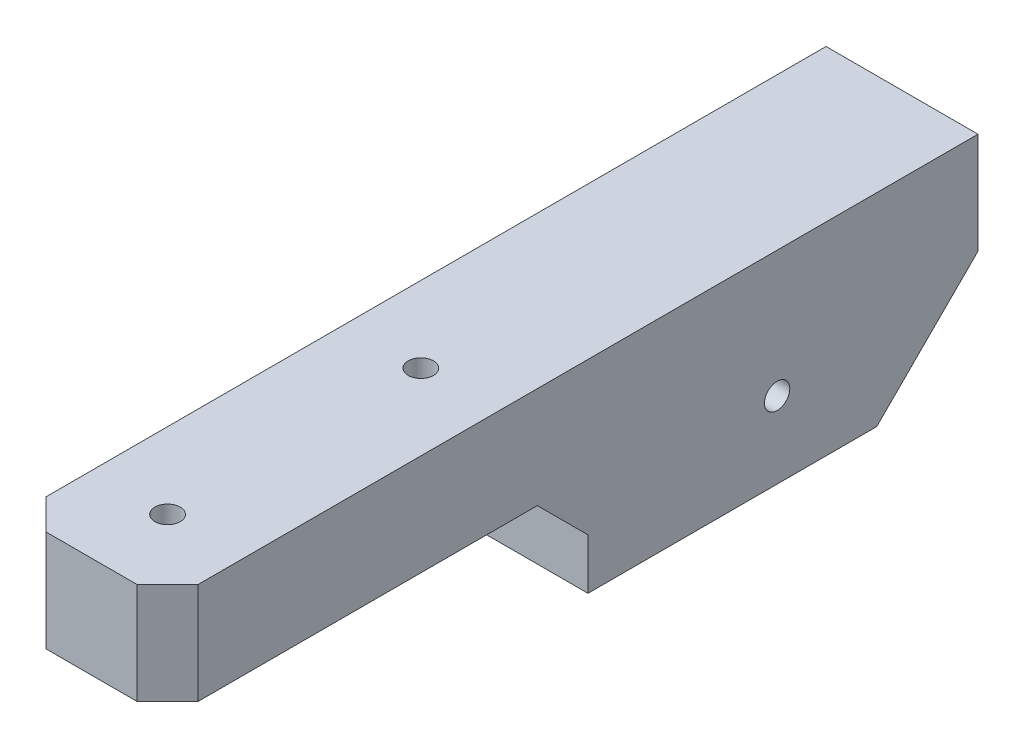
ISO-10303-21;
HEADER;
FILE_DESCRIPTION(('STEP AP214'),'2;1');
FILE_NAME('part.step','',(''),(''),'','','');
FILE_SCHEMA(('AUTOMOTIVE_DESIGN { 1 0 10303 214 1 1 1 1 }'));
ENDSEC;
DATA;
#1=APPLICATION_CONTEXT('core data for automotive mechanical design processes');
#2=APPLICATION_PROTOCOL_DEFINITION('international standard','automotive_design',2000,#1);
#3=PRODUCT_CONTEXT('',#1,'mechanical');
#4=PRODUCT('Part','Part','',(#3));
#5=PRODUCT_RELATED_PRODUCT_CATEGORY('part','',(#4));
#6=PRODUCT_DEFINITION_FORMATION('','',#4);
#7=PRODUCT_DEFINITION_CONTEXT('part definition',#1,'design');
#8=PRODUCT_DEFINITION('design','',#6,#7);
#9=PRODUCT_DEFINITION_SHAPE('','',#8);
#10=(LENGTH_UNIT() NAMED_UNIT(*) SI_UNIT(.MILLI.,.METRE.));
#11=(NAMED_UNIT(*) PLANE_ANGLE_UNIT() SI_UNIT($,.RADIAN.));
#12=(NAMED_UNIT(*) SI_UNIT($,.STERADIAN.) SOLID_ANGLE_UNIT());
#13=UNCERTAINTY_MEASURE_WITH_UNIT(LENGTH_MEASURE(1.E-05),#10,'distance_accuracy_value','');
#14=(GEOMETRIC_REPRESENTATION_CONTEXT(3) GLOBAL_UNCERTAINTY_ASSIGNED_CONTEXT((#13)) GLOBAL_UNIT_ASSIGNED_CONTEXT((#10,
#11,#12)) REPRESENTATION_CONTEXT('',''));
#15=CARTESIAN_POINT('',(0.,0.,0.));
#16=DIRECTION('',(0.,0.,1.));
#17=DIRECTION('',(1.,0.,0.));
#18=AXIS2_PLACEMENT_3D('',#15,#16,#17);
#19=CARTESIAN_POINT('',(30.,0.,80.));
#20=DIRECTION('',(0.,0.,-1.));
#21=DIRECTION('',(-1.,0.,0.));
#22=AXIS2_PLACEMENT_3D('',#19,#20,#21);
#23=PLANE('',#22);
#24=DIRECTION('',(-1.,0.,0.));
#25=VECTOR('',#24,1.);
#26=CARTESIAN_POINT('',(30.,20.,80.));
#27=LINE('',#26,#25);
#28=CARTESIAN_POINT('',(24.,20.,80.));
#29=VERTEX_POINT('',#28);
#30=CARTESIAN_POINT('',(6.00000000000001,20.,80.));
#31=VERTEX_POINT('',#30);
#32=EDGE_CURVE('E165',#29,#31,#27,.T.);
#33=ORIENTED_EDGE('',*,*,#32,.T.);
#34=DIRECTION('',(0.,-1.,0.));
#35=VECTOR('',#34,1.);
#36=CARTESIAN_POINT('',(6.00000000000001,0.,80.));
#37=LINE('',#36,#35);
#38=CARTESIAN_POINT('',(6.00000000000001,0.,80.));
#39=VERTEX_POINT('',#38);
#40=EDGE_CURVE('E197',#31,#39,#37,.T.);
#41=ORIENTED_EDGE('',*,*,#40,.T.);
#42=DIRECTION('',(-1.,0.,0.));
#43=VECTOR('',#42,1.);
#44=CARTESIAN_POINT('',(30.,0.,80.));
#45=LINE('',#44,#43);
#46=CARTESIAN_POINT('',(24.,0.,80.));
#47=VERTEX_POINT('',#46);
#48=EDGE_CURVE('E146',#47,#39,#45,.T.);
#49=ORIENTED_EDGE('',*,*,#48,.F.);
#50=DIRECTION('',(0.,1.,0.));
#51=VECTOR('',#50,1.);
#52=CARTESIAN_POINT('',(24.,0.,80.));
#53=LINE('',#52,#51);
#54=EDGE_CURVE('E195',#47,#29,#53,.T.);
#55=ORIENTED_EDGE('',*,*,#54,.T.);
#56=EDGE_LOOP('',(#33,#41,#49,#55));
#57=FACE_BOUND('',#56,.T.);
#58=ADVANCED_FACE('F41',(#57),#23,.F.);
#59=CARTESIAN_POINT('',(30.,0.,7.00000000000028));
#60=DIRECTION('',(0.,1.,0.));
#61=DIRECTION('',(0.,0.,1.));
#62=AXIS2_PLACEMENT_3D('',#59,#60,#61);
#63=PLANE('',#62);
#64=CARTESIAN_POINT('',(15.,0.,15.));
#65=DIRECTION('',(0.,1.,0.));
#66=DIRECTION('',(0.,0.,1.));
#67=AXIS2_PLACEMENT_3D('',#64,#65,#66);
#68=CIRCLE('',#67,2.5);
#69=CARTESIAN_POINT('',(15.,0.,17.5));
#70=VERTEX_POINT('',#69);
#71=EDGE_CURVE('E168',#70,#70,#68,.T.);
#72=ORIENTED_EDGE('',*,*,#71,.T.);
#73=EDGE_LOOP('',(#72));
#74=FACE_BOUND('',#73,.T.);
#75=CARTESIAN_POINT('',(15.,0.,65.));
#76=DIRECTION('',(0.,1.,0.));
#77=DIRECTION('',(0.,0.,1.));
#78=AXIS2_PLACEMENT_3D('',#75,#76,#77);
#79=CIRCLE('',#78,2.5);
#80=CARTESIAN_POINT('',(15.,0.,67.5));
#81=VERTEX_POINT('',#80);
#82=EDGE_CURVE('E404',#81,#81,#79,.T.);
#83=ORIENTED_EDGE('',*,*,#82,.T.);
#84=EDGE_LOOP('',(#83));
#85=FACE_BOUND('',#84,.T.);
#86=ORIENTED_EDGE('',*,*,#48,.T.);
#87=DIRECTION('',(-0.707106781186547,0.,-0.707106781186548));
#88=VECTOR('',#87,1.);
#89=CARTESIAN_POINT('',(6.00000000000001,0.,80.));
#90=LINE('',#89,#88);
#91=CARTESIAN_POINT('',(0.,0.,74.));
#92=VERTEX_POINT('',#91);
#93=EDGE_CURVE('E202',#39,#92,#90,.T.);
#94=ORIENTED_EDGE('',*,*,#93,.T.);
#95=DIRECTION('',(0.,0.,-1.));
#96=VECTOR('',#95,1.);
#97=CARTESIAN_POINT('',(0.,0.,7.00000000000028));
#98=LINE('',#97,#96);
#99=CARTESIAN_POINT('',(0.,0.,7.00000000000028));
#100=VERTEX_POINT('',#99);
#101=EDGE_CURVE('E143',#92,#100,#98,.T.);
#102=ORIENTED_EDGE('',*,*,#101,.T.);
#103=DIRECTION('',(-1.,0.,0.));
#104=VECTOR('',#103,1.);
#105=CARTESIAN_POINT('',(30.,0.,7.00000000000028));
#106=LINE('',#105,#104);
#107=CARTESIAN_POINT('',(30.,0.,7.00000000000028));
#108=VERTEX_POINT('',#107);
#109=EDGE_CURVE('E140',#108,#100,#106,.T.);
#110=ORIENTED_EDGE('',*,*,#109,.F.);
#111=DIRECTION('',(0.,0.,-1.));
#112=VECTOR('',#111,1.);
#113=CARTESIAN_POINT('',(30.,0.,7.00000000000028));
#114=LINE('',#113,#112);
#115=CARTESIAN_POINT('',(30.,0.,74.));
#116=VERTEX_POINT('',#115);
#117=EDGE_CURVE('E129',#116,#108,#114,.T.);
#118=ORIENTED_EDGE('',*,*,#117,.F.);
#119=DIRECTION('',(0.707106781186548,0.,-0.707106781186547));
#120=VECTOR('',#119,1.);
#121=CARTESIAN_POINT('',(30.,0.,74.));
#122=LINE('',#121,#120);
#123=EDGE_CURVE('E200',#116,#47,#122,.F.);
#124=ORIENTED_EDGE('',*,*,#123,.T.);
#125=EDGE_LOOP('',(#86,#94,#102,#110,#118,#124));
#126=FACE_BOUND('',#125,.T.);
#127=ADVANCED_FACE('F142',(#74,#85,#126),#63,.F.);
#128=CARTESIAN_POINT('',(30.,-10.,-2.99999999999977));
#129=DIRECTION('',(0.,0.707106781186549,-0.707106781186546));
#130=DIRECTION('',(0.,0.707106781186546,0.707106781186549));
#131=AXIS2_PLACEMENT_3D('',#128,#129,#130);
#132=PLANE('',#131);
#133=DIRECTION('',(0.,-0.707106781186546,-0.707106781186549));
#134=VECTOR('',#133,1.);
#135=CARTESIAN_POINT('',(0.,-10.,-2.99999999999977));
#136=LINE('',#135,#134);
#137=CARTESIAN_POINT('',(0.,-10.,-2.99999999999977));
#138=VERTEX_POINT('',#137);
#139=EDGE_CURVE('E167',#100,#138,#136,.T.);
#140=ORIENTED_EDGE('',*,*,#139,.T.);
#141=DIRECTION('',(-1.,0.,0.));
#142=VECTOR('',#141,1.);
#143=CARTESIAN_POINT('',(30.,-10.,-2.99999999999977));
#144=LINE('',#143,#142);
#145=CARTESIAN_POINT('',(30.,-10.,-2.99999999999977));
#146=VERTEX_POINT('',#145);
#147=EDGE_CURVE('E147',#146,#138,#144,.T.);
#148=ORIENTED_EDGE('',*,*,#147,.F.);
#149=DIRECTION('',(0.,-0.707106781186546,-0.707106781186549));
#150=VECTOR('',#149,1.);
#151=CARTESIAN_POINT('',(30.,-10.,-2.99999999999977));
#152=LINE('',#151,#150);
#153=EDGE_CURVE('E133',#108,#146,#152,.T.);
#154=ORIENTED_EDGE('',*,*,#153,.F.);
#155=ORIENTED_EDGE('',*,*,#109,.T.);
#156=EDGE_LOOP('',(#140,#148,#154,#155));
#157=FACE_BOUND('',#156,.T.);
#158=ADVANCED_FACE('F149',(#157),#132,.F.);
#159=CARTESIAN_POINT('',(30.,-20.,-2.99999999999977));
#160=DIRECTION('',(0.,0.,-1.));
#161=DIRECTION('',(-1.,0.,0.));
#162=AXIS2_PLACEMENT_3D('',#159,#160,#161);
#163=PLANE('',#162);
#164=DIRECTION('',(0.,-1.,0.));
#165=VECTOR('',#164,1.);
#166=CARTESIAN_POINT('',(0.,-20.,-2.99999999999977));
#167=LINE('',#166,#165);
#168=CARTESIAN_POINT('',(0.,-20.,-2.99999999999977));
#169=VERTEX_POINT('',#168);
#170=EDGE_CURVE('E170',#138,#169,#167,.T.);
#171=ORIENTED_EDGE('',*,*,#170,.T.);
#172=DIRECTION('',(-1.,0.,0.));
#173=VECTOR('',#172,1.);
#174=CARTESIAN_POINT('',(30.,-20.,-2.99999999999977));
#175=LINE('',#174,#173);
#176=CARTESIAN_POINT('',(30.,-20.,-2.99999999999977));
#177=VERTEX_POINT('',#176);
#178=EDGE_CURVE('E190',#177,#169,#175,.T.);
#179=ORIENTED_EDGE('',*,*,#178,.F.);
#180=DIRECTION('',(0.,-1.,0.));
#181=VECTOR('',#180,1.);
#182=CARTESIAN_POINT('',(30.,-20.,-2.99999999999977));
#183=LINE('',#182,#181);
#184=EDGE_CURVE('E152',#146,#177,#183,.T.);
#185=ORIENTED_EDGE('',*,*,#184,.F.);
#186=ORIENTED_EDGE('',*,*,#147,.T.);
#187=EDGE_LOOP('',(#171,#179,#185,#186));
#188=FACE_BOUND('',#187,.T.);
#189=ADVANCED_FACE('F267',(#188),#163,.F.);
#190=CARTESIAN_POINT('',(30.,-20.,-59.9999999999998));
#191=DIRECTION('',(0.,1.,0.));
#192=DIRECTION('',(0.,0.,1.));
#193=AXIS2_PLACEMENT_3D('',#190,#191,#192);
#194=PLANE('',#193);
#195=CARTESIAN_POINT('',(15.,-20.,-25.254833995939));
#196=DIRECTION('',(0.,1.,0.));
#197=DIRECTION('',(0.,0.,-1.));
#198=AXIS2_PLACEMENT_3D('',#195,#196,#197);
#199=ELLIPSE('',#198,14.1421356237309,10.);
#200=CARTESIAN_POINT('',(15.,-20.,-39.39696961967));
#201=VERTEX_POINT('',#200);
#202=EDGE_CURVE('E207',#201,#201,#199,.F.);
#203=ORIENTED_EDGE('',*,*,#202,.F.);
#204=EDGE_LOOP('',(#203));
#205=FACE_BOUND('',#204,.T.);
#206=DIRECTION('',(0.,0.,-1.));
#207=VECTOR('',#206,1.);
#208=CARTESIAN_POINT('',(0.,-20.,-59.9999999999998));
#209=LINE('',#208,#207);
#210=CARTESIAN_POINT('',(0.,-20.,-59.9999999999998));
#211=VERTEX_POINT('',#210);
#212=EDGE_CURVE('E172',#169,#211,#209,.T.);
#213=ORIENTED_EDGE('',*,*,#212,.T.);
#214=DIRECTION('',(-1.,0.,0.));
#215=VECTOR('',#214,1.);
#216=CARTESIAN_POINT('',(30.,-20.,-59.9999999999998));
#217=LINE('',#216,#215);
#218=CARTESIAN_POINT('',(30.,-20.,-59.9999999999998));
#219=VERTEX_POINT('',#218);
#220=EDGE_CURVE('E187',#219,#211,#217,.T.);
#221=ORIENTED_EDGE('',*,*,#220,.F.);
#222=DIRECTION('',(0.,0.,-1.));
#223=VECTOR('',#222,1.);
#224=CARTESIAN_POINT('',(30.,-20.,-59.9999999999998));
#225=LINE('',#224,#223);
#226=EDGE_CURVE('E154',#177,#219,#225,.T.);
#227=ORIENTED_EDGE('',*,*,#226,.F.);
#228=ORIENTED_EDGE('',*,*,#178,.T.);
#229=EDGE_LOOP('',(#213,#221,#227,#228));
#230=FACE_BOUND('',#229,.T.);
#231=ADVANCED_FACE('F274',(#205,#230),#194,.F.);
#232=CARTESIAN_POINT('',(30.,0.,-80.));
#233=DIRECTION('',(0.,0.707106781186552,0.707106781186544));
#234=DIRECTION('',(0.,-0.707106781186544,0.707106781186552));
#235=AXIS2_PLACEMENT_3D('',#232,#233,#234);
#236=PLANE('',#235);
#237=DIRECTION('',(0.,0.707106781186544,-0.707106781186552));
#238=VECTOR('',#237,1.);
#239=CARTESIAN_POINT('',(0.,0.,-80.));
#240=LINE('',#239,#238);
#241=CARTESIAN_POINT('',(0.,0.,-80.));
#242=VERTEX_POINT('',#241);
#243=EDGE_CURVE('E174',#211,#242,#240,.T.);
#244=ORIENTED_EDGE('',*,*,#243,.T.);
#245=DIRECTION('',(-1.,0.,0.));
#246=VECTOR('',#245,1.);
#247=CARTESIAN_POINT('',(30.,0.,-80.));
#248=LINE('',#247,#246);
#249=CARTESIAN_POINT('',(30.,0.,-80.));
#250=VERTEX_POINT('',#249);
#251=EDGE_CURVE('E184',#250,#242,#248,.T.);
#252=ORIENTED_EDGE('',*,*,#251,.F.);
#253=DIRECTION('',(0.,0.707106781186544,-0.707106781186552));
#254=VECTOR('',#253,1.);
#255=CARTESIAN_POINT('',(30.,0.,-80.));
#256=LINE('',#255,#254);
#257=EDGE_CURVE('E159',#219,#250,#256,.T.);
#258=ORIENTED_EDGE('',*,*,#257,.F.);
#259=ORIENTED_EDGE('',*,*,#220,.T.);
#260=EDGE_LOOP('',(#244,#252,#258,#259));
#261=FACE_BOUND('',#260,.T.);
#262=ADVANCED_FACE('F277',(#261),#236,.F.);
#263=CARTESIAN_POINT('',(30.,20.,-80.));
#264=DIRECTION('',(0.,0.,1.));
#265=DIRECTION('',(1.,0.,0.));
#266=AXIS2_PLACEMENT_3D('',#263,#264,#265);
#267=PLANE('',#266);
#268=DIRECTION('',(0.,1.,0.));
#269=VECTOR('',#268,1.);
#270=CARTESIAN_POINT('',(0.,20.,-80.));
#271=LINE('',#270,#269);
#272=CARTESIAN_POINT('',(0.,20.,-80.));
#273=VERTEX_POINT('',#272);
#274=EDGE_CURVE('E176',#242,#273,#271,.T.);
#275=ORIENTED_EDGE('',*,*,#274,.T.);
#276=DIRECTION('',(-1.,0.,0.));
#277=VECTOR('',#276,1.);
#278=CARTESIAN_POINT('',(30.,20.,-80.));
#279=LINE('',#278,#277);
#280=CARTESIAN_POINT('',(30.,20.,-80.));
#281=VERTEX_POINT('',#280);
#282=EDGE_CURVE('E181',#281,#273,#279,.T.);
#283=ORIENTED_EDGE('',*,*,#282,.F.);
#284=DIRECTION('',(0.,1.,0.));
#285=VECTOR('',#284,1.);
#286=CARTESIAN_POINT('',(30.,20.,-80.));
#287=LINE('',#286,#285);
#288=EDGE_CURVE('E161',#250,#281,#287,.T.);
#289=ORIENTED_EDGE('',*,*,#288,.F.);
#290=ORIENTED_EDGE('',*,*,#251,.T.);
#291=EDGE_LOOP('',(#275,#283,#289,#290));
#292=FACE_BOUND('',#291,.T.);
#293=ADVANCED_FACE('F282',(#292),#267,.F.);
#294=CARTESIAN_POINT('',(30.,20.,80.));
#295=DIRECTION('',(0.,-1.,0.));
#296=DIRECTION('',(0.,0.,-1.));
#297=AXIS2_PLACEMENT_3D('',#294,#295,#296);
#298=PLANE('',#297);
#299=CARTESIAN_POINT('',(15.,20.,15.));
#300=DIRECTION('',(0.,1.,0.));
#301=DIRECTION('',(0.,0.,1.));
#302=AXIS2_PLACEMENT_3D('',#299,#300,#301);
#303=CIRCLE('',#302,2.5);
#304=CARTESIAN_POINT('',(15.,20.,17.5));
#305=VERTEX_POINT('',#304);
#306=EDGE_CURVE('E401',#305,#305,#303,.T.);
#307=ORIENTED_EDGE('',*,*,#306,.F.);
#308=EDGE_LOOP('',(#307));
#309=FACE_BOUND('',#308,.T.);
#310=CARTESIAN_POINT('',(15.,20.,65.));
#311=DIRECTION('',(0.,1.,0.));
#312=DIRECTION('',(0.,0.,1.));
#313=AXIS2_PLACEMENT_3D('',#310,#311,#312);
#314=CIRCLE('',#313,2.5);
#315=CARTESIAN_POINT('',(15.,20.,67.5));
#316=VERTEX_POINT('',#315);
#317=EDGE_CURVE('E209',#316,#316,#314,.T.);
#318=ORIENTED_EDGE('',*,*,#317,.F.);
#319=EDGE_LOOP('',(#318));
#320=FACE_BOUND('',#319,.T.);
#321=DIRECTION('',(0.,0.,1.));
#322=VECTOR('',#321,1.);
#323=CARTESIAN_POINT('',(0.,20.,80.));
#324=LINE('',#323,#322);
#325=CARTESIAN_POINT('',(0.,20.,74.));
#326=VERTEX_POINT('',#325);
#327=EDGE_CURVE('E137',#273,#326,#324,.T.);
#328=ORIENTED_EDGE('',*,*,#327,.T.);
#329=DIRECTION('',(0.707106781186547,0.,0.707106781186548));
#330=VECTOR('',#329,1.);
#331=CARTESIAN_POINT('',(6.00000000000001,20.,80.));
#332=LINE('',#331,#330);
#333=EDGE_CURVE('E56',#326,#31,#332,.T.);
#334=ORIENTED_EDGE('',*,*,#333,.T.);
#335=ORIENTED_EDGE('',*,*,#32,.F.);
#336=DIRECTION('',(-0.707106781186548,0.,0.707106781186547));
#337=VECTOR('',#336,1.);
#338=CARTESIAN_POINT('',(30.,20.,74.));
#339=LINE('',#338,#337);
#340=CARTESIAN_POINT('',(30.,20.,74.));
#341=VERTEX_POINT('',#340);
#342=EDGE_CURVE('E64',#29,#341,#339,.F.);
#343=ORIENTED_EDGE('',*,*,#342,.T.);
#344=DIRECTION('',(0.,0.,1.));
#345=VECTOR('',#344,1.);
#346=CARTESIAN_POINT('',(30.,20.,80.));
#347=LINE('',#346,#345);
#348=EDGE_CURVE('E163',#281,#341,#347,.T.);
#349=ORIENTED_EDGE('',*,*,#348,.F.);
#350=ORIENTED_EDGE('',*,*,#282,.T.);
#351=EDGE_LOOP('',(#328,#334,#335,#343,#349,#350));
#352=FACE_BOUND('',#351,.T.);
#353=ADVANCED_FACE('F260',(#309,#320,#352),#298,.F.);
#354=CARTESIAN_POINT('',(30.,0.,0.));
#355=DIRECTION('',(-1.,0.,0.));
#356=DIRECTION('',(0.,0.,1.));
#357=AXIS2_PLACEMENT_3D('',#354,#355,#356);
#358=PLANE('',#357);
#359=CARTESIAN_POINT('',(30.,-4.91421356237316,-40.3406204335658));
#360=DIRECTION('',(1.,0.,0.));
#361=DIRECTION('',(0.,0.,-1.));
#362=AXIS2_PLACEMENT_3D('',#359,#360,#361);
#363=CIRCLE('',#362,2.5);
#364=CARTESIAN_POINT('',(30.,-4.91421356237316,-42.8406204335658));
#365=VERTEX_POINT('',#364);
#366=EDGE_CURVE('E216',#365,#365,#363,.T.);
#367=ORIENTED_EDGE('',*,*,#366,.F.);
#368=EDGE_LOOP('',(#367));
#369=FACE_BOUND('',#368,.T.);
#370=ORIENTED_EDGE('',*,*,#348,.T.);
#371=DIRECTION('',(0.,-1.,0.));
#372=VECTOR('',#371,1.);
#373=CARTESIAN_POINT('',(30.,0.,74.));
#374=LINE('',#373,#372);
#375=EDGE_CURVE('E11',#341,#116,#374,.T.);
#376=ORIENTED_EDGE('',*,*,#375,.T.);
#377=ORIENTED_EDGE('',*,*,#117,.T.);
#378=ORIENTED_EDGE('',*,*,#153,.T.);
#379=ORIENTED_EDGE('',*,*,#184,.T.);
#380=ORIENTED_EDGE('',*,*,#226,.T.);
#381=ORIENTED_EDGE('',*,*,#257,.T.);
#382=ORIENTED_EDGE('',*,*,#288,.T.);
#383=EDGE_LOOP('',(#370,#376,#377,#378,#379,#380,#381,#382));
#384=FACE_BOUND('',#383,.T.);
#385=ADVANCED_FACE('F131',(#369,#384),#358,.F.);
#386=CARTESIAN_POINT('',(0.,0.,0.));
#387=DIRECTION('',(-1.,0.,0.));
#388=DIRECTION('',(0.,0.,1.));
#389=AXIS2_PLACEMENT_3D('',#386,#387,#388);
#390=PLANE('',#389);
#391=CARTESIAN_POINT('',(0.,-4.91421356237316,-40.3406204335658));
#392=DIRECTION('',(-1.,0.,0.));
#393=DIRECTION('',(0.,0.,1.));
#394=AXIS2_PLACEMENT_3D('',#391,#392,#393);
#395=CIRCLE('',#394,2.5);
#396=CARTESIAN_POINT('',(0.,-4.91421356237316,-37.8406204335658));
#397=VERTEX_POINT('',#396);
#398=EDGE_CURVE('E394',#397,#397,#395,.T.);
#399=ORIENTED_EDGE('',*,*,#398,.F.);
#400=EDGE_LOOP('',(#399));
#401=FACE_BOUND('',#400,.T.);
#402=ORIENTED_EDGE('',*,*,#101,.F.);
#403=DIRECTION('',(0.,1.,0.));
#404=VECTOR('',#403,1.);
#405=CARTESIAN_POINT('',(0.,20.,74.));
#406=LINE('',#405,#404);
#407=EDGE_CURVE('E72',#92,#326,#406,.T.);
#408=ORIENTED_EDGE('',*,*,#407,.T.);
#409=ORIENTED_EDGE('',*,*,#327,.F.);
#410=ORIENTED_EDGE('',*,*,#274,.F.);
#411=ORIENTED_EDGE('',*,*,#243,.F.);
#412=ORIENTED_EDGE('',*,*,#212,.F.);
#413=ORIENTED_EDGE('',*,*,#170,.F.);
#414=ORIENTED_EDGE('',*,*,#139,.F.);
#415=EDGE_LOOP('',(#402,#408,#409,#410,#411,#412,#413,#414));
#416=FACE_BOUND('',#415,.T.);
#417=ADVANCED_FACE('F263',(#401,#416),#390,.T.);
#418=CARTESIAN_POINT('',(15.,-10.,65.));
#419=DIRECTION('',(0.,1.,0.));
#420=DIRECTION('',(0.,0.,1.));
#421=AXIS2_PLACEMENT_3D('',#418,#419,#420);
#422=CYLINDRICAL_SURFACE('',#421,2.5);
#423=ORIENTED_EDGE('',*,*,#317,.T.);
#424=EDGE_LOOP('',(#423));
#425=FACE_BOUND('',#424,.T.);
#426=ORIENTED_EDGE('',*,*,#82,.F.);
#427=EDGE_LOOP('',(#426));
#428=FACE_BOUND('',#427,.T.);
#429=ADVANCED_FACE('F256',(#425,#428),#422,.F.);
#430=CARTESIAN_POINT('',(15.,-10.,15.));
#431=DIRECTION('',(0.,1.,0.));
#432=DIRECTION('',(0.,0.,1.));
#433=AXIS2_PLACEMENT_3D('',#430,#431,#432);
#434=CYLINDRICAL_SURFACE('',#433,2.5);
#435=ORIENTED_EDGE('',*,*,#306,.T.);
#436=EDGE_LOOP('',(#435));
#437=FACE_BOUND('',#436,.T.);
#438=ORIENTED_EDGE('',*,*,#71,.F.);
#439=EDGE_LOOP('',(#438));
#440=FACE_BOUND('',#439,.T.);
#441=ADVANCED_FACE('F249',(#437,#440),#434,.F.);
#442=CARTESIAN_POINT('',(6.00000000000001,0.,80.));
#443=DIRECTION('',(-0.707106781186548,0.,0.707106781186547));
#444=DIRECTION('',(0.,1.,0.));
#445=AXIS2_PLACEMENT_3D('',#442,#443,#444);
#446=PLANE('',#445);
#447=ORIENTED_EDGE('',*,*,#333,.F.);
#448=ORIENTED_EDGE('',*,*,#407,.F.);
#449=ORIENTED_EDGE('',*,*,#93,.F.);
#450=ORIENTED_EDGE('',*,*,#40,.F.);
#451=EDGE_LOOP('',(#447,#448,#449,#450));
#452=FACE_BOUND('',#451,.T.);
#453=ADVANCED_FACE('F245',(#452),#446,.T.);
#454=CARTESIAN_POINT('',(30.,0.,74.));
#455=DIRECTION('',(-0.707106781186547,0.,-0.707106781186548));
#456=DIRECTION('',(0.,-1.,0.));
#457=AXIS2_PLACEMENT_3D('',#454,#455,#456);
#458=PLANE('',#457);
#459=ORIENTED_EDGE('',*,*,#342,.F.);
#460=ORIENTED_EDGE('',*,*,#54,.F.);
#461=ORIENTED_EDGE('',*,*,#123,.F.);
#462=ORIENTED_EDGE('',*,*,#375,.F.);
#463=EDGE_LOOP('',(#459,#460,#461,#462));
#464=FACE_BOUND('',#463,.T.);
#465=ADVANCED_FACE('F44',(#464),#458,.F.);
#466=CARTESIAN_POINT('',(15.,-47.3406204335661,2.08578643762695));
#467=DIRECTION('',(0.,0.707106781186549,-0.707106781186546));
#468=DIRECTION('',(0.,0.707106781186546,0.707106781186549));
#469=AXIS2_PLACEMENT_3D('',#466,#467,#468);
#470=CYLINDRICAL_SURFACE('',#469,10.);
#471=CARTESIAN_POINT('',(5.15749015748524,-4.91421356237316,-42.8406204335658));
#472=CARTESIAN_POINT('',(5.13973941154905,-4.77443632515328,-42.8406173442707));
#473=CARTESIAN_POINT('',(5.12203212838446,-4.63460897342132,-42.8288725304301));
#474=CARTESIAN_POINT('',(5.08864107375419,-4.35859154157292,-42.7821144276248));
#475=CARTESIAN_POINT('',(5.07295827211177,-4.2224032293203,-42.7470900356672));
#476=CARTESIAN_POINT('',(5.04533242901525,-3.95734587080235,-42.6545174243993));
#477=CARTESIAN_POINT('',(5.03339261029169,-3.82848320967946,-42.5969498906911));
#478=CARTESIAN_POINT('',(5.01461408479767,-3.58201252404039,-42.4607744726276));
#479=CARTESIAN_POINT('',(5.00777401901081,-3.46440150839776,-42.3821722013434));
#480=CARTESIAN_POINT('',(5.00004748837898,-3.2461581929523,-42.2078933441368));
#481=CARTESIAN_POINT('',(4.99904660801388,-3.14523752505762,-42.1125828611013));
#482=CARTESIAN_POINT('',(5.00280244113664,-2.96058926878909,-41.9066584219292));
#483=CARTESIAN_POINT('',(5.00755890121862,-2.87686092389521,-41.796045139526));
#484=CARTESIAN_POINT('',(5.0222099185125,-2.729874217238,-41.5642477353844));
#485=CARTESIAN_POINT('',(5.0320392560741,-2.66637218871252,-41.4432136675026));
#486=CARTESIAN_POINT('',(5.05575681775051,-2.55999413488404,-41.1927743402492));
#487=CARTESIAN_POINT('',(5.06964548166812,-2.51712034585526,-41.0633681749964));
#488=CARTESIAN_POINT('',(5.10033921152785,-2.45233694746898,-40.7970330912408));
#489=CARTESIAN_POINT('',(5.11719598880024,-2.43085361200105,-40.6600065581702));
#490=CARTESIAN_POINT('',(5.15183869280065,-2.4107792985185,-40.3843919426935));
#491=CARTESIAN_POINT('',(5.16962477467925,-2.4121921553529,-40.2458036025872));
#492=CARTESIAN_POINT('',(5.20462384045039,-2.43818748401926,-39.967405822497));
#493=CARTESIAN_POINT('',(5.22181374103312,-2.46331026351617,-39.8276434466494));
#494=CARTESIAN_POINT('',(5.25318636085969,-2.53694891857734,-39.5540612270077));
#495=CARTESIAN_POINT('',(5.26736927897453,-2.58546324641346,-39.4202409906849));
#496=CARTESIAN_POINT('',(5.29092251427623,-2.70417364275079,-39.1635288338424));
#497=CARTESIAN_POINT('',(5.30033344388147,-2.77417831419085,-39.0405523120148));
#498=CARTESIAN_POINT('',(5.31336343353388,-2.93409098842329,-38.8079690976636));
#499=CARTESIAN_POINT('',(5.31698373938627,-3.02399470535977,-38.6983595340374));
#500=CARTESIAN_POINT('',(5.3179652695269,-3.2181998910283,-38.4987814094427));
#501=CARTESIAN_POINT('',(5.31550258240923,-3.32201591685209,-38.4083406833851));
#502=CARTESIAN_POINT('',(5.30498313703835,-3.54287524249821,-38.2458100951274));
#503=CARTESIAN_POINT('',(5.29692639350026,-3.65991850752572,-38.1737201846562));
#504=CARTESIAN_POINT('',(5.27619675718424,-3.90347858572432,-38.0499833449891));
#505=CARTESIAN_POINT('',(5.26353872440476,-4.0299638722723,-37.9982717115403));
#506=CARTESIAN_POINT('',(5.23501941869869,-4.28932817790657,-37.9161556151954));
#507=CARTESIAN_POINT('',(5.21915763471296,-4.42220821449759,-37.8857545552038));
#508=CARTESIAN_POINT('',(5.1854813680381,-4.69461031811948,-37.8463826834377));
#509=CARTESIAN_POINT('',(5.16762555069656,-4.83421476163981,-37.8380163440371));
#510=CARTESIAN_POINT('',(5.13228770997388,-5.11292933876823,-37.8446340937402));
#511=CARTESIAN_POINT('',(5.11480572925876,-5.25203941445924,-37.859620833868));
#512=CARTESIAN_POINT('',(5.08185522974434,-5.52824228066552,-37.9130583827952));
#513=CARTESIAN_POINT('',(5.06642253252603,-5.66526935688281,-37.9518729956221));
#514=CARTESIAN_POINT('',(5.03964209391337,-5.93109728771381,-38.0523613656017));
#515=CARTESIAN_POINT('',(5.02829377125285,-6.0598993107249,-38.11403186749));
#516=CARTESIAN_POINT('',(5.01114654103111,-6.3030919369878,-38.2572215370533));
#517=CARTESIAN_POINT('',(5.00524715415146,-6.41770825225742,-38.3383450550363));
#518=CARTESIAN_POINT('',(4.99929958695374,-6.6318337689214,-38.518707162724));
#519=CARTESIAN_POINT('',(4.9992505006565,-6.73134530706193,-38.6179429451744));
#520=CARTESIAN_POINT('',(5.00493819034485,-6.91018010302529,-38.8290604844389));
#521=CARTESIAN_POINT('',(5.01054031975332,-6.98991935455188,-38.9405941260685));
#522=CARTESIAN_POINT('',(5.02672220464397,-7.13000575664811,-39.1749022034006));
#523=CARTESIAN_POINT('',(5.03730216890471,-7.19035209366834,-39.2976771104064));
#524=CARTESIAN_POINT('',(5.06241088869692,-7.29051961250615,-39.5519632502072));
#525=CARTESIAN_POINT('',(5.07696740464915,-7.33019057455237,-39.6835307951038));
#526=CARTESIAN_POINT('',(5.10846558031297,-7.38747291251155,-39.9511118703181));
#527=CARTESIAN_POINT('',(5.12540765130392,-7.40508047941307,-40.0871261641621));
#528=CARTESIAN_POINT('',(5.16038006249293,-7.41804243314246,-40.3638375577929));
#529=CARTESIAN_POINT('',(5.1784274534617,-7.41278067714883,-40.504561653922));
#530=CARTESIAN_POINT('',(5.21317548680488,-7.37870948446046,-40.7833136107175));
#531=CARTESIAN_POINT('',(5.22987604421058,-7.34989856337667,-40.921341300858));
#532=CARTESIAN_POINT('',(5.26012519779055,-7.26908758564696,-41.1918720169879));
#533=CARTESIAN_POINT('',(5.27365128241231,-7.21692911191948,-41.3243304217799));
#534=CARTESIAN_POINT('',(5.29576147650762,-7.09069538986497,-41.5787994754307));
#535=CARTESIAN_POINT('',(5.30434668276684,-7.01662501111624,-41.7008124378658));
#536=CARTESIAN_POINT('',(5.31535625445239,-6.85080482432693,-41.927710258687));
#537=CARTESIAN_POINT('',(5.31793220347514,-6.75955424853385,-42.0329526680453));
#538=CARTESIAN_POINT('',(5.31705436395844,-6.56086854593291,-42.226830673721));
#539=CARTESIAN_POINT('',(5.31360065197449,-6.45343362462517,-42.315466480868));
#540=CARTESIAN_POINT('',(5.30120135705024,-6.22765240510789,-42.4721527177341));
#541=CARTESIAN_POINT('',(5.2923554514277,-6.10953654362405,-42.5405440511761));
#542=CARTESIAN_POINT('',(5.27027921101307,-5.86414451420111,-42.6570986545518));
#543=CARTESIAN_POINT('',(5.25705037816569,-5.73687149592307,-42.7052688410812));
#544=CARTESIAN_POINT('',(5.22966397190443,-5.49418812778538,-42.7752379180942));
#545=CARTESIAN_POINT('',(5.21587359393111,-5.37949946968478,-42.7997211678207));
#546=CARTESIAN_POINT('',(5.18720879073969,-5.1479568614474,-42.8324143830007));
#547=CARTESIAN_POINT('',(5.1723342769297,-5.0311027349391,-42.8406230169989));
#548=CARTESIAN_POINT('',(5.15749015748524,-4.91421356237316,-42.8406204335658));
#549=B_SPLINE_CURVE_WITH_KNOTS('',3,(#471,#472,#473,#474,#475,#476,#477,#478,#479,#480,#481,
#482,#483,#484,#485,#486,#487,#488,#489,#490,#491,#492,#493,#494,#495,#496,#497,#498,#499,#500,
#501,#502,#503,#504,#505,#506,#507,#508,#509,#510,#511,#512,#513,#514,#515,#516,#517,#518,#519,
#520,#521,#522,#523,#524,#525,#526,#527,#528,#529,#530,#531,#532,#533,#534,#535,#536,#537,#538,
#539,#540,#541,#542,#543,#544,#545,#546,#547,#548),.UNSPECIFIED.,.T.,.F.,(4,2,2,2,2,2,2,2,2,2,2,
2,2,2,2,2,2,2,2,2,2,2,2,2,2,2,2,2,2,2,2,2,2,2,2,2,2,2,4),(0.,0.422287178610022,
0.844775908089487,1.26762741007883,1.69036618744394,2.10479306392654,2.51920170032316,
2.92841050331658,3.33766365798775,3.75491839343855,4.17224301498341,4.59931338527284,
5.02635550184713,5.4496995317993,5.87295247049788,6.28409756883475,6.69524158566241,
7.10506942901188,7.51496269939115,7.93598868903793,8.35706247672252,8.78473086579736,
9.21233836732459,9.63189338558719,10.0513834313593,10.4611093223664,10.8708523994835,
11.2835324163366,11.6962836682117,12.1202231551149,12.5441893665184,12.9710769218713,
13.3978696793173,13.8137743974371,14.2296738350671,14.6381089561188,15.0464042588404,
15.3995144080808,15.7526534446987),.UNSPECIFIED.);
#550=CARTESIAN_POINT('',(5.15749015748524,-4.91421356237316,-42.8406204335658));
#551=VERTEX_POINT('',#550);
#552=EDGE_CURVE('E46',#551,#551,#549,.T.);
#553=ORIENTED_EDGE('',*,*,#552,.F.);
#554=EDGE_LOOP('',(#553));
#555=FACE_BOUND('',#554,.T.);
#556=CARTESIAN_POINT('',(24.8425098425148,-4.91421356237316,-42.8406204335658));
#557=CARTESIAN_POINT('',(24.8247486739475,-5.0540705739875,-42.8406174023746));
#558=CARTESIAN_POINT('',(24.8069334061453,-5.19396514707408,-42.8288592452663));
#559=CARTESIAN_POINT('',(24.7731734525494,-5.4700980039915,-42.782058329637));
#560=CARTESIAN_POINT('',(24.7572296984094,-5.6063344409673,-42.7470040314741));
#561=CARTESIAN_POINT('',(24.7290389375018,-5.87148738596766,-42.6543530542678));
#562=CARTESIAN_POINT('',(24.7167952419088,-6.00039725420725,-42.5967362893381));
#563=CARTESIAN_POINT('',(24.6975019029421,-6.24695792606038,-42.4604372860675));
#564=CARTESIAN_POINT('',(24.6904507278472,-6.36461204104675,-42.3817612692576));
#565=CARTESIAN_POINT('',(24.6824991552137,-6.58281695251877,-42.2073992208979));
#566=CARTESIAN_POINT('',(24.681474767978,-6.68367072647906,-42.1120979363248));
#567=CARTESIAN_POINT('',(24.6853690391113,-6.86819119980118,-41.9062124953895));
#568=CARTESIAN_POINT('',(24.6902874478112,-6.95185862102482,-41.7956289812384));
#569=CARTESIAN_POINT('',(24.7053653795341,-7.09863344800242,-41.5640762044398));
#570=CARTESIAN_POINT('',(24.7154512061762,-7.16201011520354,-41.4432724057895));
#571=CARTESIAN_POINT('',(24.7396718830434,-7.2682164230122,-41.1933308726902));
#572=CARTESIAN_POINT('',(24.7538072390257,-7.31104349533472,-41.0641920988244));
#573=CARTESIAN_POINT('',(24.7849153227802,-7.37588543044821,-40.7981367332712));
#574=CARTESIAN_POINT('',(24.8019426088695,-7.39743213041962,-40.6611125243772));
#575=CARTESIAN_POINT('',(24.8367480450152,-7.41762961931086,-40.385470810337));
#576=CARTESIAN_POINT('',(24.8545263126334,-7.41627681009688,-40.2468530582216));
#577=CARTESIAN_POINT('',(24.8893365158324,-7.39038345688737,-39.9683350718652));
#578=CARTESIAN_POINT('',(24.9063409808796,-7.36529708776666,-39.8284816273916));
#579=CARTESIAN_POINT('',(24.9372399879017,-7.2916987543,-39.5547129605859));
#580=CARTESIAN_POINT('',(24.951134750091,-7.24318844949494,-39.4207973183057));
#581=CARTESIAN_POINT('',(24.974127316921,-7.12453537522652,-39.1640687038938));
#582=CARTESIAN_POINT('',(24.9832710261053,-7.05461040519684,-39.0411593583954));
#583=CARTESIAN_POINT('',(24.9959270225668,-6.89489018939773,-38.8086943117412));
#584=CARTESIAN_POINT('',(24.9994403805836,-6.80509872539263,-38.69913607523));
#585=CARTESIAN_POINT('',(25.0004222545737,-6.61095371272102,-38.4994393436759));
#586=CARTESIAN_POINT('',(24.9980500863661,-6.50705438218617,-38.4088594646764));
#587=CARTESIAN_POINT('',(24.9878551575788,-6.28598312283862,-38.2460821968346));
#588=CARTESIAN_POINT('',(24.9800324758947,-6.16881138616283,-38.1738845419327));
#589=CARTESIAN_POINT('',(24.9598111620308,-5.92492051124323,-38.0499586068711));
#590=CARTESIAN_POINT('',(24.9474259539252,-5.79823024072257,-37.9981711908128));
#591=CARTESIAN_POINT('',(24.9193790487805,-5.5384403568169,-37.9159739536831));
#592=CARTESIAN_POINT('',(24.9037168651461,-5.40533979383499,-37.885567310352));
#593=CARTESIAN_POINT('',(24.8703216758933,-5.13279237535752,-37.8462967968975));
#594=CARTESIAN_POINT('',(24.8525466103978,-4.99327006965336,-37.8379919018411));
#595=CARTESIAN_POINT('',(24.8171798335938,-4.71474981158978,-37.8446989658685));
#596=CARTESIAN_POINT('',(24.7995881464561,-4.57575192985664,-37.8597139605433));
#597=CARTESIAN_POINT('',(24.7662592065712,-4.29968160514398,-37.9131862209294));
#598=CARTESIAN_POINT('',(24.750557162724,-4.16267829688991,-37.9520245121598));
#599=CARTESIAN_POINT('',(24.7232116497526,-3.89689526924614,-38.0525554638487));
#600=CARTESIAN_POINT('',(24.7115675660763,-3.76811430704978,-38.1142446607622));
#601=CARTESIAN_POINT('',(24.6939384869873,-3.52490011946613,-38.2575079099132));
#602=CARTESIAN_POINT('',(24.6878532322847,-3.41024635936101,-38.3386948806422));
#603=CARTESIAN_POINT('',(24.6817294914339,-3.19606171784471,-38.5192033591697));
#604=CARTESIAN_POINT('',(24.6816899652239,-3.09652823819746,-38.6185217448324));
#605=CARTESIAN_POINT('',(24.687582273097,-2.9178678008716,-38.8295814596089));
#606=CARTESIAN_POINT('',(24.693362745067,-2.83828746549967,-38.940944003305));
#607=CARTESIAN_POINT('',(24.7099862913244,-2.69845930200025,-39.1748573865303));
#608=CARTESIAN_POINT('',(24.7208296667089,-2.63821262402912,-39.2974088911321));
#609=CARTESIAN_POINT('',(24.7464508780764,-2.53812730234595,-39.5513238745485));
#610=CARTESIAN_POINT('',(24.7612595792977,-2.49845625341965,-39.6827501579714));
#611=CARTESIAN_POINT('',(24.793135887072,-2.44112732370802,-39.9500591332622));
#612=CARTESIAN_POINT('',(24.8102038894306,-2.42347330573332,-40.085942602837));
#613=CARTESIAN_POINT('',(24.8452782404306,-2.41036811758561,-40.3626421942059));
#614=CARTESIAN_POINT('',(24.8632974604879,-2.41556892281302,-40.5034879310432));
#615=CARTESIAN_POINT('',(24.8978149341081,-2.44956548826737,-40.7825053139435));
#616=CARTESIAN_POINT('',(24.9143131176567,-2.47836233403139,-40.9206768366797));
#617=CARTESIAN_POINT('',(24.9440498283056,-2.55913810186979,-41.1913057997153));
#618=CARTESIAN_POINT('',(24.9572698213718,-2.61124436413422,-41.3237274081455));
#619=CARTESIAN_POINT('',(24.9788273229871,-2.7373526890162,-41.5781265575097));
#620=CARTESIAN_POINT('',(24.9871658112285,-2.81135035365305,-41.7001061898952));
#621=CARTESIAN_POINT('',(24.9978647346249,-2.97705565400917,-41.9270202468688));
#622=CARTESIAN_POINT('',(25.0003687829329,-3.06827670299158,-42.032303329639));
#623=CARTESIAN_POINT('',(24.9995428224501,-3.26691280784577,-42.2262676834034));
#624=CARTESIAN_POINT('',(24.9962128620621,-3.37432772935549,-42.3149490921295));
#625=CARTESIAN_POINT('',(24.9841913356903,-3.60028487373865,-42.4718669425079));
#626=CARTESIAN_POINT('',(24.9755878533707,-3.71861770455189,-42.5404124486871));
#627=CARTESIAN_POINT('',(24.9540146704258,-3.96449031092356,-42.6571992983899));
#628=CARTESIAN_POINT('',(24.9410465508439,-4.09202673945375,-42.7054479800024));
#629=CARTESIAN_POINT('',(24.9140998694638,-4.33487444091898,-42.7753835174349));
#630=CARTESIAN_POINT('',(24.9005065917347,-4.4494495934873,-42.7998138147332));
#631=CARTESIAN_POINT('',(24.8721247902528,-4.68074550614906,-42.8324342266505));
#632=CARTESIAN_POINT('',(24.8573361652379,-4.79746644737157,-42.8406229638846));
#633=CARTESIAN_POINT('',(24.8425098425148,-4.91421356237316,-42.8406204335658));
#634=B_SPLINE_CURVE_WITH_KNOTS('',3,(#556,#557,#558,#559,#560,#561,#562,#563,#564,#565,#566,
#567,#568,#569,#570,#571,#572,#573,#574,#575,#576,#577,#578,#579,#580,#581,#582,#583,#584,#585,
#586,#587,#588,#589,#590,#591,#592,#593,#594,#595,#596,#597,#598,#599,#600,#601,#602,#603,#604,
#605,#606,#607,#608,#609,#610,#611,#612,#613,#614,#615,#616,#617,#618,#619,#620,#621,#622,#623,
#624,#625,#626,#627,#628,#629,#630,#631,#632,#633),.UNSPECIFIED.,.T.,.F.,(4,2,2,2,2,2,2,2,2,2,2,
2,2,2,2,2,2,2,2,2,2,2,2,2,2,2,2,2,2,2,2,2,2,2,2,2,2,2,4),(0.,0.422528666862586,
0.845266787617251,1.26838210312094,1.69137255544731,2.10562948787069,2.51986901709999,
2.9283587351881,3.33689949296557,3.75424016963783,4.1716464224549,4.59889169450027,
5.02610670147845,5.44911339352227,5.87203963164334,6.2836431822147,6.69524077500175,
7.10563689474151,7.51609399716287,7.93683746933192,8.3576357150074,8.78534624979392,
9.21299198238335,9.63276295972162,10.0524617227359,10.4615201708164,10.8706029492129,
11.2829674760028,11.6954043405251,12.1196819133185,12.54397900612,12.9706229061467,
13.3971811515924,13.8131234966669,14.2290623908188,14.6382363272586,15.0472622040512,
15.3999425553672,15.7526528148836),.UNSPECIFIED.);
#635=CARTESIAN_POINT('',(24.8425098425148,-4.91421356237316,-42.8406204335658));
#636=VERTEX_POINT('',#635);
#637=EDGE_CURVE('E211',#636,#636,#634,.T.);
#638=ORIENTED_EDGE('',*,*,#637,.F.);
#639=EDGE_LOOP('',(#638));
#640=FACE_BOUND('',#639,.T.);
#641=ORIENTED_EDGE('',*,*,#202,.T.);
#642=EDGE_LOOP('',(#641));
#643=FACE_BOUND('',#642,.T.);
#644=CARTESIAN_POINT('',(15.,5.69238815542507,-50.947222151364));
#645=DIRECTION('',(0.,-0.707106781186549,0.707106781186546));
#646=DIRECTION('',(0.,-0.707106781186546,-0.707106781186549));
#647=AXIS2_PLACEMENT_3D('',#644,#645,#646);
#648=CIRCLE('',#647,10.);
#649=CARTESIAN_POINT('',(15.,-1.37867965644039,-58.0182899632295));
#650=VERTEX_POINT('',#649);
#651=EDGE_CURVE('E210',#650,#650,#648,.T.);
#652=ORIENTED_EDGE('',*,*,#651,.F.);
#653=EDGE_LOOP('',(#652));
#654=FACE_BOUND('',#653,.T.);
#655=ADVANCED_FACE('F217',(#555,#640,#643,#654),#470,.F.);
#656=CARTESIAN_POINT('',(15.,5.69238815542507,-50.947222151364));
#657=DIRECTION('',(0.,-0.707106781186549,0.707106781186546));
#658=DIRECTION('',(0.,-0.707106781186546,-0.707106781186549));
#659=AXIS2_PLACEMENT_3D('',#656,#657,#658);
#660=PLANE('',#659);
#661=ORIENTED_EDGE('',*,*,#651,.T.);
#662=EDGE_LOOP('',(#661));
#663=FACE_BOUND('',#662,.T.);
#664=ADVANCED_FACE('F225',(#663),#660,.T.);
#665=CARTESIAN_POINT('',(-18.,-4.91421356237316,-40.3406204335658));
#666=DIRECTION('',(1.,0.,0.));
#667=DIRECTION('',(0.,0.,-1.));
#668=AXIS2_PLACEMENT_3D('',#665,#666,#667);
#669=CYLINDRICAL_SURFACE('',#668,2.5);
#670=ORIENTED_EDGE('',*,*,#637,.T.);
#671=EDGE_LOOP('',(#670));
#672=FACE_BOUND('',#671,.T.);
#673=ORIENTED_EDGE('',*,*,#366,.T.);
#674=EDGE_LOOP('',(#673));
#675=FACE_BOUND('',#674,.T.);
#676=ADVANCED_FACE('F221',(#672,#675),#669,.F.);
#677=ORIENTED_EDGE('',*,*,#398,.T.);
#678=EDGE_LOOP('',(#677));
#679=FACE_BOUND('',#678,.T.);
#680=ORIENTED_EDGE('',*,*,#552,.T.);
#681=EDGE_LOOP('',(#680));
#682=FACE_BOUND('',#681,.T.);
#683=ADVANCED_FACE('F224',(#679,#682),#669,.F.);
#684=CLOSED_SHELL('',(#58,#127,#158,#189,#231,#262,#293,#353,#385,#417,#429,#441,#453,#465,#655,
#664,#676,#683));
#685=MANIFOLD_SOLID_BREP('B2',#684);
#686=ADVANCED_BREP_SHAPE_REPRESENTATION('',(#18,#685),#14);
#687=SHAPE_DEFINITION_REPRESENTATION(#9,#686);
ENDSEC;
END-ISO-10303-21;
